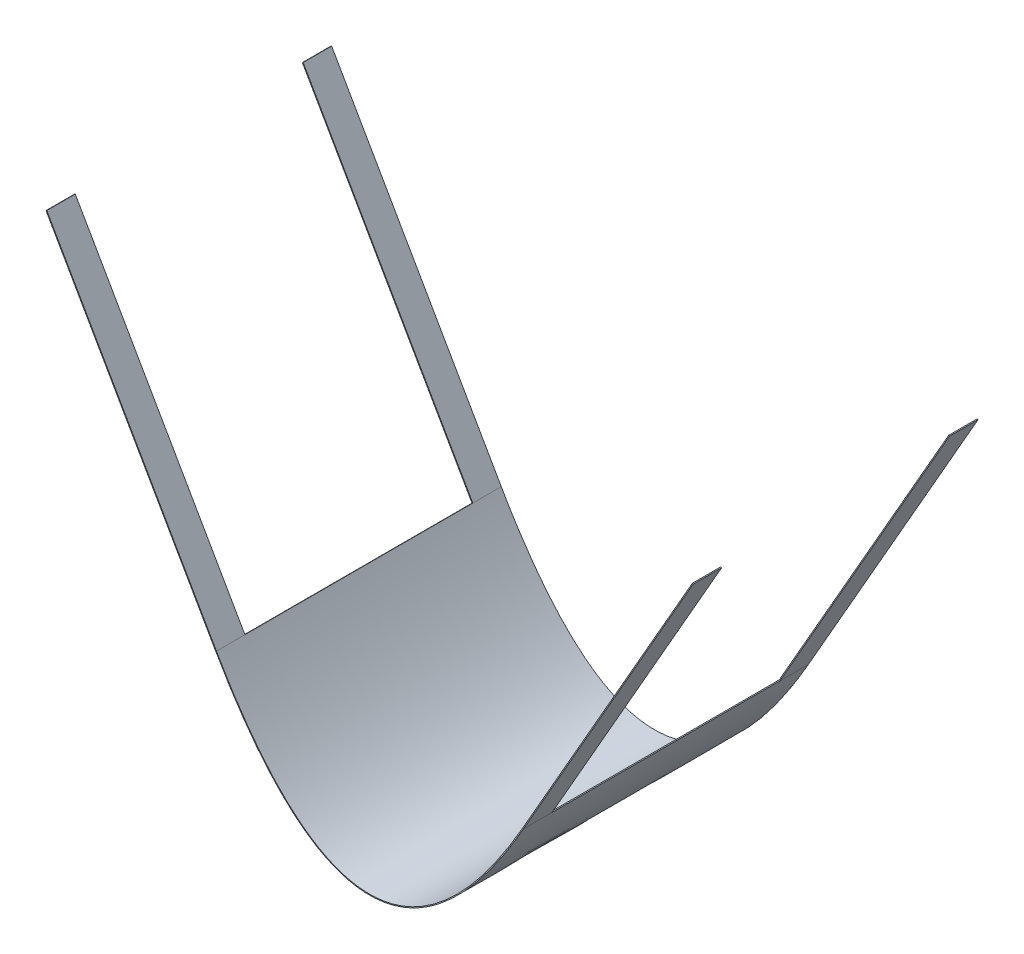
ISO-10303-21;
HEADER;
FILE_DESCRIPTION(('STEP AP214'),'2;1');
FILE_NAME('part.step','',(''),(''),'','','');
FILE_SCHEMA(('AUTOMOTIVE_DESIGN { 1 0 10303 214 1 1 1 1 }'));
ENDSEC;
DATA;
#1=APPLICATION_CONTEXT('core data for automotive mechanical design processes');
#2=APPLICATION_PROTOCOL_DEFINITION('international standard','automotive_design',2000,#1);
#3=PRODUCT_CONTEXT('',#1,'mechanical');
#4=PRODUCT('Part','Part','',(#3));
#5=PRODUCT_RELATED_PRODUCT_CATEGORY('part','',(#4));
#6=PRODUCT_DEFINITION_FORMATION('','',#4);
#7=PRODUCT_DEFINITION_CONTEXT('part definition',#1,'design');
#8=PRODUCT_DEFINITION('design','',#6,#7);
#9=PRODUCT_DEFINITION_SHAPE('','',#8);
#10=(LENGTH_UNIT() NAMED_UNIT(*) SI_UNIT(.MILLI.,.METRE.));
#11=(NAMED_UNIT(*) PLANE_ANGLE_UNIT() SI_UNIT($,.RADIAN.));
#12=(NAMED_UNIT(*) SI_UNIT($,.STERADIAN.) SOLID_ANGLE_UNIT());
#13=UNCERTAINTY_MEASURE_WITH_UNIT(LENGTH_MEASURE(1.E-05),#10,'distance_accuracy_value','');
#14=(GEOMETRIC_REPRESENTATION_CONTEXT(3) GLOBAL_UNCERTAINTY_ASSIGNED_CONTEXT((#13)) GLOBAL_UNIT_ASSIGNED_CONTEXT((#10,
#11,#12)) REPRESENTATION_CONTEXT('',''));
#15=CARTESIAN_POINT('',(0.,0.,0.));
#16=DIRECTION('',(0.,0.,1.));
#17=DIRECTION('',(1.,0.,0.));
#18=AXIS2_PLACEMENT_3D('',#15,#16,#17);
#19=CARTESIAN_POINT('',(134.432129079069,117.587227260159,125.));
#20=DIRECTION('',(-0.496268967708273,-0.868168826720797,0.));
#21=DIRECTION('',(0.868168826720797,-0.496268967708273,0.));
#22=AXIS2_PLACEMENT_3D('',#19,#20,#21);
#23=PLANE('',#22);
#24=DIRECTION('',(-0.868168826720789,0.496268967708286,0.));
#25=VECTOR('',#24,1.);
#26=CARTESIAN_POINT('',(134.432129079069,117.587227260159,100.));
#27=LINE('',#26,#25);
#28=CARTESIAN_POINT('',(135.121238085279,117.193313767041,100.));
#29=VERTEX_POINT('',#28);
#30=CARTESIAN_POINT('',(134.432129079069,117.587227260159,100.));
#31=VERTEX_POINT('',#30);
#32=EDGE_CURVE('E161',#29,#31,#27,.T.);
#33=ORIENTED_EDGE('',*,*,#32,.F.);
#34=DIRECTION('',(0.,0.,-1.));
#35=VECTOR('',#34,1.);
#36=CARTESIAN_POINT('',(135.121238085279,117.193313767041,125.));
#37=LINE('',#36,#35);
#38=CARTESIAN_POINT('',(135.121238085279,117.193313767041,-100.));
#39=VERTEX_POINT('',#38);
#40=EDGE_CURVE('E51',#29,#39,#37,.T.);
#41=ORIENTED_EDGE('',*,*,#40,.T.);
#42=DIRECTION('',(-0.868168826720789,0.496268967708286,0.));
#43=VECTOR('',#42,1.);
#44=CARTESIAN_POINT('',(134.432129079069,117.587227260159,-100.));
#45=LINE('',#44,#43);
#46=CARTESIAN_POINT('',(134.432129079069,117.587227260159,-100.));
#47=VERTEX_POINT('',#46);
#48=EDGE_CURVE('E367',#39,#47,#45,.T.);
#49=ORIENTED_EDGE('',*,*,#48,.T.);
#50=DIRECTION('',(0.,0.,-1.));
#51=VECTOR('',#50,1.);
#52=CARTESIAN_POINT('',(134.432129079069,117.587227260159,125.));
#53=LINE('',#52,#51);
#54=EDGE_CURVE('E59',#31,#47,#53,.T.);
#55=ORIENTED_EDGE('',*,*,#54,.F.);
#56=EDGE_LOOP('',(#33,#41,#49,#55));
#57=FACE_BOUND('',#56,.T.);
#58=ADVANCED_FACE('F33',(#57),#23,.F.);
#59=CARTESIAN_POINT('',(-135.121238085279,117.193313767041,125.));
#60=DIRECTION('',(0.496268967708273,-0.868168826720797,0.));
#61=DIRECTION('',(0.868168826720797,0.496268967708273,0.));
#62=AXIS2_PLACEMENT_3D('',#59,#60,#61);
#63=PLANE('',#62);
#64=DIRECTION('',(0.,0.,-1.));
#65=VECTOR('',#64,1.);
#66=CARTESIAN_POINT('',(-135.121238085279,117.193313767041,125.));
#67=LINE('',#66,#65);
#68=CARTESIAN_POINT('',(-135.121238085279,117.193313767041,100.));
#69=VERTEX_POINT('',#68);
#70=CARTESIAN_POINT('',(-135.121238085279,117.193313767041,-100.));
#71=VERTEX_POINT('',#70);
#72=EDGE_CURVE('E278',#69,#71,#67,.T.);
#73=ORIENTED_EDGE('',*,*,#72,.F.);
#74=DIRECTION('',(0.868168826720789,0.496268967708286,0.));
#75=VECTOR('',#74,1.);
#76=CARTESIAN_POINT('',(-134.432129079069,117.587227260159,100.));
#77=LINE('',#76,#75);
#78=CARTESIAN_POINT('',(-134.432129079069,117.587227260159,100.));
#79=VERTEX_POINT('',#78);
#80=EDGE_CURVE('E172',#69,#79,#77,.T.);
#81=ORIENTED_EDGE('',*,*,#80,.T.);
#82=DIRECTION('',(0.,0.,-1.));
#83=VECTOR('',#82,1.);
#84=CARTESIAN_POINT('',(-134.432129079069,117.587227260159,125.));
#85=LINE('',#84,#83);
#86=CARTESIAN_POINT('',(-134.432129079069,117.587227260159,-100.));
#87=VERTEX_POINT('',#86);
#88=EDGE_CURVE('E43',#79,#87,#85,.T.);
#89=ORIENTED_EDGE('',*,*,#88,.T.);
#90=DIRECTION('',(0.868168826720789,0.496268967708286,0.));
#91=VECTOR('',#90,1.);
#92=CARTESIAN_POINT('',(-134.432129079069,117.587227260159,-100.));
#93=LINE('',#92,#91);
#94=EDGE_CURVE('E226',#71,#87,#93,.T.);
#95=ORIENTED_EDGE('',*,*,#94,.F.);
#96=EDGE_LOOP('',(#73,#81,#89,#95));
#97=FACE_BOUND('',#96,.T.);
#98=ADVANCED_FACE('F269',(#97),#63,.F.);
#99=CARTESIAN_POINT('',(134.432129079069,117.587227260159,125.));
#100=CARTESIAN_POINT('',(0.,-117.587227260159,125.));
#101=CARTESIAN_POINT('',(-134.432129079069,117.587227260159,125.));
#102=B_SPLINE_CURVE_WITH_KNOTS('',2,(#99,#100,#101),.UNSPECIFIED.,.F.,.F.,(3,3),(0.,1.),.UNSPECIFIED.);
#103=DIRECTION('',(0.,0.,-1.));
#104=VECTOR('',#103,1.);
#105=SURFACE_OF_LINEAR_EXTRUSION('',#102,#104);
#106=CARTESIAN_POINT('',(134.432129079069,117.587227260159,-125.));
#107=CARTESIAN_POINT('',(0.,-117.587227260159,-125.));
#108=CARTESIAN_POINT('',(-134.432129079069,117.587227260159,-125.));
#109=B_SPLINE_CURVE_WITH_KNOTS('',2,(#106,#107,#108),.UNSPECIFIED.,.F.,.F.,(3,3),(0.,1.),.UNSPECIFIED.);
#110=CARTESIAN_POINT('',(134.432129079069,117.587227260159,-125.));
#111=VERTEX_POINT('',#110);
#112=CARTESIAN_POINT('',(-134.432129079069,117.587227260159,-125.));
#113=VERTEX_POINT('',#112);
#114=EDGE_CURVE('E239',#111,#113,#109,.T.);
#115=ORIENTED_EDGE('',*,*,#114,.T.);
#116=DIRECTION('',(0.,0.,-1.));
#117=VECTOR('',#116,1.);
#118=CARTESIAN_POINT('',(-134.432129079069,117.587227260159,-125.));
#119=LINE('',#118,#117);
#120=EDGE_CURVE('E315',#87,#113,#119,.T.);
#121=ORIENTED_EDGE('',*,*,#120,.F.);
#122=ORIENTED_EDGE('',*,*,#88,.F.);
#123=CARTESIAN_POINT('',(-134.432129079069,117.587227260159,125.));
#124=VERTEX_POINT('',#123);
#125=EDGE_CURVE('E11',#124,#79,#85,.T.);
#126=ORIENTED_EDGE('',*,*,#125,.F.);
#127=CARTESIAN_POINT('',(134.432129079069,117.587227260159,125.));
#128=VERTEX_POINT('',#127);
#129=EDGE_CURVE('E240',#128,#124,#102,.T.);
#130=ORIENTED_EDGE('',*,*,#129,.F.);
#131=EDGE_CURVE('E342',#128,#31,#53,.T.);
#132=ORIENTED_EDGE('',*,*,#131,.T.);
#133=ORIENTED_EDGE('',*,*,#54,.T.);
#134=DIRECTION('',(0.,0.,-1.));
#135=VECTOR('',#134,1.);
#136=CARTESIAN_POINT('',(134.432129079069,117.587227260159,-125.));
#137=LINE('',#136,#135);
#138=EDGE_CURVE('E201',#47,#111,#137,.T.);
#139=ORIENTED_EDGE('',*,*,#138,.T.);
#140=EDGE_LOOP('',(#115,#121,#122,#126,#130,#132,#133,#139));
#141=FACE_BOUND('',#140,.T.);
#142=ADVANCED_FACE('F35',(#141),#105,.F.);
#143=CARTESIAN_POINT('',(-135.121238085279,117.193313767041,125.));
#144=CARTESIAN_POINT('',(-109.888419219021,73.0438742908726,125.));
#145=CARTESIAN_POINT('',(-67.7508855212166,26.9649811299898,125.));
#146=CARTESIAN_POINT('',(-33.9429716044823,4.77688975113719,125.));
#147=CARTESIAN_POINT('',(0.,-2.65062991704577,125.));
#148=CARTESIAN_POINT('',(33.9429716044823,4.77688975113719,125.));
#149=CARTESIAN_POINT('',(67.7508855212166,26.9649811299898,125.));
#150=CARTESIAN_POINT('',(109.888419219021,73.0438742908727,125.));
#151=CARTESIAN_POINT('',(135.121238085279,117.193313767041,125.));
#152=B_SPLINE_CURVE_WITH_KNOTS('',2,(#143,#144,#145,#146,#147,#148,#149,#150,#151),
.UNSPECIFIED.,.F.,.F.,(3,1,1,1,1,1,1,3),(0.,0.1875,0.3125,0.4375,0.5625,0.6875,0.8125,1.),.UNSPECIFIED.);
#153=DIRECTION('',(0.,0.,-1.));
#154=VECTOR('',#153,1.);
#155=SURFACE_OF_LINEAR_EXTRUSION('',#152,#154);
#156=CARTESIAN_POINT('',(-135.121238085279,117.193313767041,-125.));
#157=CARTESIAN_POINT('',(-109.888419219021,73.0438742908726,-125.));
#158=CARTESIAN_POINT('',(-67.7508855212166,26.9649811299898,-125.));
#159=CARTESIAN_POINT('',(-33.9429716044823,4.77688975113719,-125.));
#160=CARTESIAN_POINT('',(0.,-2.65062991704577,-125.));
#161=CARTESIAN_POINT('',(33.9429716044823,4.77688975113719,-125.));
#162=CARTESIAN_POINT('',(67.7508855212166,26.9649811299898,-125.));
#163=CARTESIAN_POINT('',(109.888419219021,73.0438742908727,-125.));
#164=CARTESIAN_POINT('',(135.121238085279,117.193313767041,-125.));
#165=B_SPLINE_CURVE_WITH_KNOTS('',2,(#156,#157,#158,#159,#160,#161,#162,#163,#164),
.UNSPECIFIED.,.F.,.F.,(3,1,1,1,1,1,1,3),(0.,0.1875,0.3125,0.4375,0.5625,0.6875,0.8125,1.),.UNSPECIFIED.);
#166=CARTESIAN_POINT('',(-135.121238085279,117.193313767041,-125.));
#167=VERTEX_POINT('',#166);
#168=CARTESIAN_POINT('',(135.121238085279,117.193313767041,-125.));
#169=VERTEX_POINT('',#168);
#170=EDGE_CURVE('E247',#167,#169,#165,.T.);
#171=ORIENTED_EDGE('',*,*,#170,.T.);
#172=DIRECTION('',(0.,0.,1.));
#173=VECTOR('',#172,1.);
#174=CARTESIAN_POINT('',(135.121238085279,117.193313767041,-125.));
#175=LINE('',#174,#173);
#176=EDGE_CURVE('E206',#169,#39,#175,.T.);
#177=ORIENTED_EDGE('',*,*,#176,.T.);
#178=ORIENTED_EDGE('',*,*,#40,.F.);
#179=CARTESIAN_POINT('',(135.121238085279,117.193313767041,125.));
#180=VERTEX_POINT('',#179);
#181=EDGE_CURVE('E285',#180,#29,#37,.T.);
#182=ORIENTED_EDGE('',*,*,#181,.F.);
#183=CARTESIAN_POINT('',(-135.121238085279,117.193313767041,125.));
#184=VERTEX_POINT('',#183);
#185=EDGE_CURVE('E246',#184,#180,#152,.T.);
#186=ORIENTED_EDGE('',*,*,#185,.F.);
#187=EDGE_CURVE('E284',#184,#69,#67,.T.);
#188=ORIENTED_EDGE('',*,*,#187,.T.);
#189=ORIENTED_EDGE('',*,*,#72,.T.);
#190=DIRECTION('',(0.,0.,1.));
#191=VECTOR('',#190,1.);
#192=CARTESIAN_POINT('',(-135.121238085279,117.193313767041,-125.));
#193=LINE('',#192,#191);
#194=EDGE_CURVE('E319',#167,#71,#193,.T.);
#195=ORIENTED_EDGE('',*,*,#194,.F.);
#196=EDGE_LOOP('',(#171,#177,#178,#182,#186,#188,#189,#195));
#197=FACE_BOUND('',#196,.T.);
#198=ADVANCED_FACE('F263',(#197),#155,.F.);
#199=CARTESIAN_POINT('',(0.,0.,125.));
#200=DIRECTION('',(0.,0.,-1.));
#201=DIRECTION('',(-1.,0.,0.));
#202=AXIS2_PLACEMENT_3D('',#199,#200,#201);
#203=PLANE('',#202);
#204=ORIENTED_EDGE('',*,*,#129,.T.);
#205=DIRECTION('',(0.496268967708273,-0.868168826720797,0.));
#206=VECTOR('',#205,1.);
#207=CARTESIAN_POINT('',(-283.312819391551,378.037875276398,125.));
#208=LINE('',#207,#206);
#209=CARTESIAN_POINT('',(-283.312819391551,378.037875276398,125.));
#210=VERTEX_POINT('',#209);
#211=EDGE_CURVE('E180',#210,#124,#208,.T.);
#212=ORIENTED_EDGE('',*,*,#211,.F.);
#213=DIRECTION('',(-0.868168826720789,-0.496268967708286,0.));
#214=VECTOR('',#213,1.);
#215=CARTESIAN_POINT('',(-283.312819391551,378.037875276398,125.));
#216=LINE('',#215,#214);
#217=CARTESIAN_POINT('',(-284.001928397761,377.64396178328,125.));
#218=VERTEX_POINT('',#217);
#219=EDGE_CURVE('E171',#210,#218,#216,.T.);
#220=ORIENTED_EDGE('',*,*,#219,.T.);
#221=DIRECTION('',(0.496268967708273,-0.868168826720797,0.));
#222=VECTOR('',#221,1.);
#223=CARTESIAN_POINT('',(-284.001928397761,377.64396178328,125.));
#224=LINE('',#223,#222);
#225=EDGE_CURVE('E182',#218,#184,#224,.T.);
#226=ORIENTED_EDGE('',*,*,#225,.T.);
#227=ORIENTED_EDGE('',*,*,#185,.T.);
#228=DIRECTION('',(-0.496268967708273,-0.868168826720797,0.));
#229=VECTOR('',#228,1.);
#230=CARTESIAN_POINT('',(284.001928397761,377.64396178328,125.));
#231=LINE('',#230,#229);
#232=CARTESIAN_POINT('',(284.001928397761,377.64396178328,125.));
#233=VERTEX_POINT('',#232);
#234=EDGE_CURVE('E195',#233,#180,#231,.T.);
#235=ORIENTED_EDGE('',*,*,#234,.F.);
#236=DIRECTION('',(0.868168826720789,-0.496268967708286,0.));
#237=VECTOR('',#236,1.);
#238=CARTESIAN_POINT('',(283.312819391551,378.037875276398,125.));
#239=LINE('',#238,#237);
#240=CARTESIAN_POINT('',(283.312819391551,378.037875276398,125.));
#241=VERTEX_POINT('',#240);
#242=EDGE_CURVE('E188',#241,#233,#239,.T.);
#243=ORIENTED_EDGE('',*,*,#242,.F.);
#244=DIRECTION('',(-0.496268967708273,-0.868168826720797,0.));
#245=VECTOR('',#244,1.);
#246=CARTESIAN_POINT('',(283.312819391551,378.037875276398,125.));
#247=LINE('',#246,#245);
#248=EDGE_CURVE('E197',#241,#128,#247,.T.);
#249=ORIENTED_EDGE('',*,*,#248,.T.);
#250=EDGE_LOOP('',(#204,#212,#220,#226,#227,#235,#243,#249));
#251=FACE_BOUND('',#250,.T.);
#252=ADVANCED_FACE('F266',(#251),#203,.F.);
#253=CARTESIAN_POINT('',(0.,0.,-125.));
#254=DIRECTION('',(0.,0.,-1.));
#255=DIRECTION('',(-1.,0.,0.));
#256=AXIS2_PLACEMENT_3D('',#253,#254,#255);
#257=PLANE('',#256);
#258=ORIENTED_EDGE('',*,*,#114,.F.);
#259=DIRECTION('',(-0.496268967708273,-0.868168826720797,0.));
#260=VECTOR('',#259,1.);
#261=CARTESIAN_POINT('',(283.312819391551,378.037875276398,-125.));
#262=LINE('',#261,#260);
#263=CARTESIAN_POINT('',(283.312819391551,378.037875276398,-125.));
#264=VERTEX_POINT('',#263);
#265=EDGE_CURVE('E215',#264,#111,#262,.T.);
#266=ORIENTED_EDGE('',*,*,#265,.F.);
#267=DIRECTION('',(0.868168826720789,-0.496268967708286,0.));
#268=VECTOR('',#267,1.);
#269=CARTESIAN_POINT('',(283.312819391551,378.037875276398,-125.));
#270=LINE('',#269,#268);
#271=CARTESIAN_POINT('',(284.001928397761,377.64396178328,-125.));
#272=VERTEX_POINT('',#271);
#273=EDGE_CURVE('E212',#264,#272,#270,.T.);
#274=ORIENTED_EDGE('',*,*,#273,.T.);
#275=DIRECTION('',(-0.496268967708273,-0.868168826720797,0.));
#276=VECTOR('',#275,1.);
#277=CARTESIAN_POINT('',(284.001928397761,377.64396178328,-125.));
#278=LINE('',#277,#276);
#279=EDGE_CURVE('E218',#272,#169,#278,.T.);
#280=ORIENTED_EDGE('',*,*,#279,.T.);
#281=ORIENTED_EDGE('',*,*,#170,.F.);
#282=DIRECTION('',(0.496268967708273,-0.868168826720797,0.));
#283=VECTOR('',#282,1.);
#284=CARTESIAN_POINT('',(-284.001928397761,377.64396178328,-125.));
#285=LINE('',#284,#283);
#286=CARTESIAN_POINT('',(-284.001928397761,377.64396178328,-125.));
#287=VERTEX_POINT('',#286);
#288=EDGE_CURVE('E233',#287,#167,#285,.T.);
#289=ORIENTED_EDGE('',*,*,#288,.F.);
#290=DIRECTION('',(-0.868168826720789,-0.496268967708286,0.));
#291=VECTOR('',#290,1.);
#292=CARTESIAN_POINT('',(-283.312819391551,378.037875276398,-125.));
#293=LINE('',#292,#291);
#294=CARTESIAN_POINT('',(-283.312819391551,378.037875276398,-125.));
#295=VERTEX_POINT('',#294);
#296=EDGE_CURVE('E225',#295,#287,#293,.T.);
#297=ORIENTED_EDGE('',*,*,#296,.F.);
#298=DIRECTION('',(0.496268967708273,-0.868168826720797,0.));
#299=VECTOR('',#298,1.);
#300=CARTESIAN_POINT('',(-283.312819391551,378.037875276398,-125.));
#301=LINE('',#300,#299);
#302=EDGE_CURVE('E236',#295,#113,#301,.T.);
#303=ORIENTED_EDGE('',*,*,#302,.T.);
#304=EDGE_LOOP('',(#258,#266,#274,#280,#281,#289,#297,#303));
#305=FACE_BOUND('',#304,.T.);
#306=ADVANCED_FACE('F398',(#305),#257,.T.);
#307=CARTESIAN_POINT('',(-283.312819391551,378.037875276398,-125.));
#308=DIRECTION('',(-0.868168826720797,-0.496268967708273,0.));
#309=DIRECTION('',(0.496268967708273,-0.868168826720797,0.));
#310=AXIS2_PLACEMENT_3D('',#307,#308,#309);
#311=PLANE('',#310);
#312=ORIENTED_EDGE('',*,*,#120,.T.);
#313=ORIENTED_EDGE('',*,*,#302,.F.);
#314=DIRECTION('',(0.,0.,-1.));
#315=VECTOR('',#314,1.);
#316=CARTESIAN_POINT('',(-283.312819391551,378.037875276398,-125.));
#317=LINE('',#316,#315);
#318=CARTESIAN_POINT('',(-283.312819391551,378.037875276398,-100.));
#319=VERTEX_POINT('',#318);
#320=EDGE_CURVE('E222',#319,#295,#317,.T.);
#321=ORIENTED_EDGE('',*,*,#320,.F.);
#322=DIRECTION('',(0.496268967708273,-0.868168826720797,0.));
#323=VECTOR('',#322,1.);
#324=CARTESIAN_POINT('',(-283.312819391551,378.037875276398,-100.));
#325=LINE('',#324,#323);
#326=EDGE_CURVE('E232',#319,#87,#325,.T.);
#327=ORIENTED_EDGE('',*,*,#326,.T.);
#328=EDGE_LOOP('',(#312,#313,#321,#327));
#329=FACE_BOUND('',#328,.T.);
#330=ADVANCED_FACE('F329',(#329),#311,.F.);
#331=CARTESIAN_POINT('',(-284.001928397761,377.64396178328,-125.));
#332=DIRECTION('',(0.868168826720797,0.496268967708273,0.));
#333=DIRECTION('',(-0.496268967708273,0.868168826720797,0.));
#334=AXIS2_PLACEMENT_3D('',#331,#332,#333);
#335=PLANE('',#334);
#336=ORIENTED_EDGE('',*,*,#194,.T.);
#337=DIRECTION('',(0.496268967708273,-0.868168826720797,0.));
#338=VECTOR('',#337,1.);
#339=CARTESIAN_POINT('',(-284.001928397761,377.64396178328,-100.));
#340=LINE('',#339,#338);
#341=CARTESIAN_POINT('',(-284.001928397761,377.64396178328,-100.));
#342=VERTEX_POINT('',#341);
#343=EDGE_CURVE('E237',#342,#71,#340,.T.);
#344=ORIENTED_EDGE('',*,*,#343,.F.);
#345=DIRECTION('',(0.,0.,1.));
#346=VECTOR('',#345,1.);
#347=CARTESIAN_POINT('',(-284.001928397761,377.64396178328,-125.));
#348=LINE('',#347,#346);
#349=EDGE_CURVE('E228',#287,#342,#348,.T.);
#350=ORIENTED_EDGE('',*,*,#349,.F.);
#351=ORIENTED_EDGE('',*,*,#288,.T.);
#352=EDGE_LOOP('',(#336,#344,#350,#351));
#353=FACE_BOUND('',#352,.T.);
#354=ADVANCED_FACE('F404',(#353),#335,.F.);
#355=CARTESIAN_POINT('',(-283.312819391551,378.037875276398,-100.));
#356=DIRECTION('',(0.,0.,-1.));
#357=DIRECTION('',(-1.,0.,0.));
#358=AXIS2_PLACEMENT_3D('',#355,#356,#357);
#359=PLANE('',#358);
#360=ORIENTED_EDGE('',*,*,#94,.T.);
#361=ORIENTED_EDGE('',*,*,#326,.F.);
#362=DIRECTION('',(0.868168826720789,0.496268967708286,0.));
#363=VECTOR('',#362,1.);
#364=CARTESIAN_POINT('',(-283.312819391551,378.037875276398,-100.));
#365=LINE('',#364,#363);
#366=EDGE_CURVE('E230',#342,#319,#365,.T.);
#367=ORIENTED_EDGE('',*,*,#366,.F.);
#368=ORIENTED_EDGE('',*,*,#343,.T.);
#369=EDGE_LOOP('',(#360,#361,#367,#368));
#370=FACE_BOUND('',#369,.T.);
#371=ADVANCED_FACE('F324',(#370),#359,.F.);
#372=CARTESIAN_POINT('',(-232.650921367663,406.997597234421,0.));
#373=DIRECTION('',(0.496268967708286,-0.868168826720789,0.));
#374=DIRECTION('',(0.868168826720789,0.496268967708286,0.));
#375=AXIS2_PLACEMENT_3D('',#372,#373,#374);
#376=PLANE('',#375);
#377=ORIENTED_EDGE('',*,*,#320,.T.);
#378=ORIENTED_EDGE('',*,*,#296,.T.);
#379=ORIENTED_EDGE('',*,*,#349,.T.);
#380=ORIENTED_EDGE('',*,*,#366,.T.);
#381=EDGE_LOOP('',(#377,#378,#379,#380));
#382=FACE_BOUND('',#381,.T.);
#383=ADVANCED_FACE('F402',(#382),#376,.F.);
#384=CARTESIAN_POINT('',(283.312819391551,378.037875276398,-125.));
#385=DIRECTION('',(-0.868168826720797,0.496268967708273,0.));
#386=DIRECTION('',(-0.496268967708273,-0.868168826720797,0.));
#387=AXIS2_PLACEMENT_3D('',#384,#385,#386);
#388=PLANE('',#387);
#389=ORIENTED_EDGE('',*,*,#138,.F.);
#390=DIRECTION('',(-0.496268967708273,-0.868168826720797,0.));
#391=VECTOR('',#390,1.);
#392=CARTESIAN_POINT('',(283.312819391551,378.037875276398,-100.));
#393=LINE('',#392,#391);
#394=CARTESIAN_POINT('',(283.312819391551,378.037875276398,-100.));
#395=VERTEX_POINT('',#394);
#396=EDGE_CURVE('E320',#395,#47,#393,.T.);
#397=ORIENTED_EDGE('',*,*,#396,.F.);
#398=DIRECTION('',(0.,0.,-1.));
#399=VECTOR('',#398,1.);
#400=CARTESIAN_POINT('',(283.312819391551,378.037875276398,-125.));
#401=LINE('',#400,#399);
#402=EDGE_CURVE('E202',#395,#264,#401,.T.);
#403=ORIENTED_EDGE('',*,*,#402,.T.);
#404=ORIENTED_EDGE('',*,*,#265,.T.);
#405=EDGE_LOOP('',(#389,#397,#403,#404));
#406=FACE_BOUND('',#405,.T.);
#407=ADVANCED_FACE('F377',(#406),#388,.T.);
#408=CARTESIAN_POINT('',(283.312819391551,378.037875276398,-100.));
#409=DIRECTION('',(0.,0.,1.));
#410=DIRECTION('',(1.,0.,0.));
#411=AXIS2_PLACEMENT_3D('',#408,#409,#410);
#412=PLANE('',#411);
#413=ORIENTED_EDGE('',*,*,#48,.F.);
#414=DIRECTION('',(-0.496268967708273,-0.868168826720797,0.));
#415=VECTOR('',#414,1.);
#416=CARTESIAN_POINT('',(284.001928397761,377.64396178328,-100.));
#417=LINE('',#416,#415);
#418=CARTESIAN_POINT('',(284.001928397761,377.64396178328,-100.));
#419=VERTEX_POINT('',#418);
#420=EDGE_CURVE('E221',#419,#39,#417,.T.);
#421=ORIENTED_EDGE('',*,*,#420,.F.);
#422=DIRECTION('',(-0.868168826720789,0.496268967708286,0.));
#423=VECTOR('',#422,1.);
#424=CARTESIAN_POINT('',(283.312819391551,378.037875276398,-100.));
#425=LINE('',#424,#423);
#426=EDGE_CURVE('E205',#419,#395,#425,.T.);
#427=ORIENTED_EDGE('',*,*,#426,.T.);
#428=ORIENTED_EDGE('',*,*,#396,.T.);
#429=EDGE_LOOP('',(#413,#421,#427,#428));
#430=FACE_BOUND('',#429,.T.);
#431=ADVANCED_FACE('F372',(#430),#412,.T.);
#432=CARTESIAN_POINT('',(284.001928397761,377.64396178328,-125.));
#433=DIRECTION('',(0.868168826720797,-0.496268967708273,0.));
#434=DIRECTION('',(0.496268967708273,0.868168826720797,0.));
#435=AXIS2_PLACEMENT_3D('',#432,#433,#434);
#436=PLANE('',#435);
#437=ORIENTED_EDGE('',*,*,#176,.F.);
#438=ORIENTED_EDGE('',*,*,#279,.F.);
#439=DIRECTION('',(0.,0.,1.));
#440=VECTOR('',#439,1.);
#441=CARTESIAN_POINT('',(284.001928397761,377.64396178328,-125.));
#442=LINE('',#441,#440);
#443=EDGE_CURVE('E209',#272,#419,#442,.T.);
#444=ORIENTED_EDGE('',*,*,#443,.T.);
#445=ORIENTED_EDGE('',*,*,#420,.T.);
#446=EDGE_LOOP('',(#437,#438,#444,#445));
#447=FACE_BOUND('',#446,.T.);
#448=ADVANCED_FACE('F392',(#447),#436,.T.);
#449=CARTESIAN_POINT('',(232.650921367663,406.997597234421,0.));
#450=DIRECTION('',(-0.496268967708286,-0.868168826720789,0.));
#451=DIRECTION('',(-0.868168826720789,0.496268967708286,0.));
#452=AXIS2_PLACEMENT_3D('',#449,#450,#451);
#453=PLANE('',#452);
#454=ORIENTED_EDGE('',*,*,#402,.F.);
#455=ORIENTED_EDGE('',*,*,#426,.F.);
#456=ORIENTED_EDGE('',*,*,#443,.F.);
#457=ORIENTED_EDGE('',*,*,#273,.F.);
#458=EDGE_LOOP('',(#454,#455,#456,#457));
#459=FACE_BOUND('',#458,.T.);
#460=ADVANCED_FACE('F395',(#459),#453,.F.);
#461=CARTESIAN_POINT('',(283.312819391551,378.037875276398,125.));
#462=DIRECTION('',(0.868168826720797,-0.496268967708273,0.));
#463=DIRECTION('',(0.496268967708273,0.868168826720797,0.));
#464=AXIS2_PLACEMENT_3D('',#461,#462,#463);
#465=PLANE('',#464);
#466=ORIENTED_EDGE('',*,*,#131,.F.);
#467=ORIENTED_EDGE('',*,*,#248,.F.);
#468=DIRECTION('',(0.,0.,1.));
#469=VECTOR('',#468,1.);
#470=CARTESIAN_POINT('',(283.312819391551,378.037875276398,125.));
#471=LINE('',#470,#469);
#472=CARTESIAN_POINT('',(283.312819391551,378.037875276398,100.));
#473=VERTEX_POINT('',#472);
#474=EDGE_CURVE('E185',#473,#241,#471,.T.);
#475=ORIENTED_EDGE('',*,*,#474,.F.);
#476=DIRECTION('',(-0.496268967708273,-0.868168826720797,0.));
#477=VECTOR('',#476,1.);
#478=CARTESIAN_POINT('',(283.312819391551,378.037875276398,100.));
#479=LINE('',#478,#477);
#480=EDGE_CURVE('E194',#473,#31,#479,.T.);
#481=ORIENTED_EDGE('',*,*,#480,.T.);
#482=EDGE_LOOP('',(#466,#467,#475,#481));
#483=FACE_BOUND('',#482,.T.);
#484=ADVANCED_FACE('F363',(#483),#465,.F.);
#485=CARTESIAN_POINT('',(284.001928397761,377.64396178328,125.));
#486=DIRECTION('',(-0.868168826720797,0.496268967708273,0.));
#487=DIRECTION('',(-0.496268967708273,-0.868168826720797,0.));
#488=AXIS2_PLACEMENT_3D('',#485,#486,#487);
#489=PLANE('',#488);
#490=ORIENTED_EDGE('',*,*,#181,.T.);
#491=DIRECTION('',(-0.496268967708273,-0.868168826720797,0.));
#492=VECTOR('',#491,1.);
#493=CARTESIAN_POINT('',(284.001928397761,377.64396178328,100.));
#494=LINE('',#493,#492);
#495=CARTESIAN_POINT('',(284.001928397761,377.64396178328,100.));
#496=VERTEX_POINT('',#495);
#497=EDGE_CURVE('E198',#496,#29,#494,.T.);
#498=ORIENTED_EDGE('',*,*,#497,.F.);
#499=DIRECTION('',(0.,0.,-1.));
#500=VECTOR('',#499,1.);
#501=CARTESIAN_POINT('',(284.001928397761,377.64396178328,125.));
#502=LINE('',#501,#500);
#503=EDGE_CURVE('E190',#233,#496,#502,.T.);
#504=ORIENTED_EDGE('',*,*,#503,.F.);
#505=ORIENTED_EDGE('',*,*,#234,.T.);
#506=EDGE_LOOP('',(#490,#498,#504,#505));
#507=FACE_BOUND('',#506,.T.);
#508=ADVANCED_FACE('F476',(#507),#489,.F.);
#509=CARTESIAN_POINT('',(283.312819391551,378.037875276398,100.));
#510=DIRECTION('',(0.,0.,1.));
#511=DIRECTION('',(1.,0.,0.));
#512=AXIS2_PLACEMENT_3D('',#509,#510,#511);
#513=PLANE('',#512);
#514=ORIENTED_EDGE('',*,*,#32,.T.);
#515=ORIENTED_EDGE('',*,*,#480,.F.);
#516=DIRECTION('',(-0.868168826720789,0.496268967708286,0.));
#517=VECTOR('',#516,1.);
#518=CARTESIAN_POINT('',(283.312819391551,378.037875276398,100.));
#519=LINE('',#518,#517);
#520=EDGE_CURVE('E192',#496,#473,#519,.T.);
#521=ORIENTED_EDGE('',*,*,#520,.F.);
#522=ORIENTED_EDGE('',*,*,#497,.T.);
#523=EDGE_LOOP('',(#514,#515,#521,#522));
#524=FACE_BOUND('',#523,.T.);
#525=ADVANCED_FACE('F483',(#524),#513,.F.);
#526=CARTESIAN_POINT('',(232.650921367663,406.997597234421,0.));
#527=DIRECTION('',(-0.496268967708286,-0.868168826720789,0.));
#528=DIRECTION('',(-0.868168826720789,0.496268967708286,0.));
#529=AXIS2_PLACEMENT_3D('',#526,#527,#528);
#530=PLANE('',#529);
#531=ORIENTED_EDGE('',*,*,#474,.T.);
#532=ORIENTED_EDGE('',*,*,#242,.T.);
#533=ORIENTED_EDGE('',*,*,#503,.T.);
#534=ORIENTED_EDGE('',*,*,#520,.T.);
#535=EDGE_LOOP('',(#531,#532,#533,#534));
#536=FACE_BOUND('',#535,.T.);
#537=ADVANCED_FACE('F491',(#536),#530,.F.);
#538=CARTESIAN_POINT('',(-283.312819391551,378.037875276398,125.));
#539=DIRECTION('',(0.868168826720797,0.496268967708273,0.));
#540=DIRECTION('',(-0.496268967708273,0.868168826720797,0.));
#541=AXIS2_PLACEMENT_3D('',#538,#539,#540);
#542=PLANE('',#541);
#543=ORIENTED_EDGE('',*,*,#125,.T.);
#544=DIRECTION('',(0.496268967708273,-0.868168826720797,0.));
#545=VECTOR('',#544,1.);
#546=CARTESIAN_POINT('',(-283.312819391551,378.037875276398,100.));
#547=LINE('',#546,#545);
#548=CARTESIAN_POINT('',(-283.312819391551,378.037875276398,100.));
#549=VERTEX_POINT('',#548);
#550=EDGE_CURVE('E151',#549,#79,#547,.T.);
#551=ORIENTED_EDGE('',*,*,#550,.F.);
#552=DIRECTION('',(0.,0.,1.));
#553=VECTOR('',#552,1.);
#554=CARTESIAN_POINT('',(-283.312819391551,378.037875276398,125.));
#555=LINE('',#554,#553);
#556=EDGE_CURVE('E154',#549,#210,#555,.T.);
#557=ORIENTED_EDGE('',*,*,#556,.T.);
#558=ORIENTED_EDGE('',*,*,#211,.T.);
#559=EDGE_LOOP('',(#543,#551,#557,#558));
#560=FACE_BOUND('',#559,.T.);
#561=ADVANCED_FACE('F153',(#560),#542,.T.);
#562=CARTESIAN_POINT('',(-283.312819391551,378.037875276398,100.));
#563=DIRECTION('',(0.,0.,-1.));
#564=DIRECTION('',(-1.,0.,0.));
#565=AXIS2_PLACEMENT_3D('',#562,#563,#564);
#566=PLANE('',#565);
#567=ORIENTED_EDGE('',*,*,#80,.F.);
#568=DIRECTION('',(0.496268967708273,-0.868168826720797,0.));
#569=VECTOR('',#568,1.);
#570=CARTESIAN_POINT('',(-284.001928397761,377.64396178328,100.));
#571=LINE('',#570,#569);
#572=CARTESIAN_POINT('',(-284.001928397761,377.64396178328,100.));
#573=VERTEX_POINT('',#572);
#574=EDGE_CURVE('E162',#573,#69,#571,.T.);
#575=ORIENTED_EDGE('',*,*,#574,.F.);
#576=DIRECTION('',(0.868168826720789,0.496268967708286,0.));
#577=VECTOR('',#576,1.);
#578=CARTESIAN_POINT('',(-283.312819391551,378.037875276398,100.));
#579=LINE('',#578,#577);
#580=EDGE_CURVE('E168',#573,#549,#579,.T.);
#581=ORIENTED_EDGE('',*,*,#580,.T.);
#582=ORIENTED_EDGE('',*,*,#550,.T.);
#583=EDGE_LOOP('',(#567,#575,#581,#582));
#584=FACE_BOUND('',#583,.T.);
#585=ADVANCED_FACE('F174',(#584),#566,.T.);
#586=CARTESIAN_POINT('',(-284.001928397761,377.64396178328,125.));
#587=DIRECTION('',(-0.868168826720797,-0.496268967708273,0.));
#588=DIRECTION('',(0.496268967708273,-0.868168826720797,0.));
#589=AXIS2_PLACEMENT_3D('',#586,#587,#588);
#590=PLANE('',#589);
#591=ORIENTED_EDGE('',*,*,#187,.F.);
#592=ORIENTED_EDGE('',*,*,#225,.F.);
#593=DIRECTION('',(0.,0.,-1.));
#594=VECTOR('',#593,1.);
#595=CARTESIAN_POINT('',(-284.001928397761,377.64396178328,125.));
#596=LINE('',#595,#594);
#597=EDGE_CURVE('E175',#218,#573,#596,.T.);
#598=ORIENTED_EDGE('',*,*,#597,.T.);
#599=ORIENTED_EDGE('',*,*,#574,.T.);
#600=EDGE_LOOP('',(#591,#592,#598,#599));
#601=FACE_BOUND('',#600,.T.);
#602=ADVANCED_FACE('F309',(#601),#590,.T.);
#603=CARTESIAN_POINT('',(-232.650921367663,406.997597234421,0.));
#604=DIRECTION('',(0.496268967708286,-0.868168826720789,0.));
#605=DIRECTION('',(0.868168826720789,0.496268967708286,0.));
#606=AXIS2_PLACEMENT_3D('',#603,#604,#605);
#607=PLANE('',#606);
#608=ORIENTED_EDGE('',*,*,#556,.F.);
#609=ORIENTED_EDGE('',*,*,#580,.F.);
#610=ORIENTED_EDGE('',*,*,#597,.F.);
#611=ORIENTED_EDGE('',*,*,#219,.F.);
#612=EDGE_LOOP('',(#608,#609,#610,#611));
#613=FACE_BOUND('',#612,.T.);
#614=ADVANCED_FACE('F166',(#613),#607,.F.);
#615=CLOSED_SHELL('',(#58,#98,#142,#198,#252,#306,#330,#354,#371,#383,#407,#431,#448,#460,#484,
#508,#525,#537,#561,#585,#602,#614));
#616=MANIFOLD_SOLID_BREP('B2',#615);
#617=ADVANCED_BREP_SHAPE_REPRESENTATION('',(#18,#616),#14);
#618=SHAPE_DEFINITION_REPRESENTATION(#9,#617);
ENDSEC;
END-ISO-10303-21;
